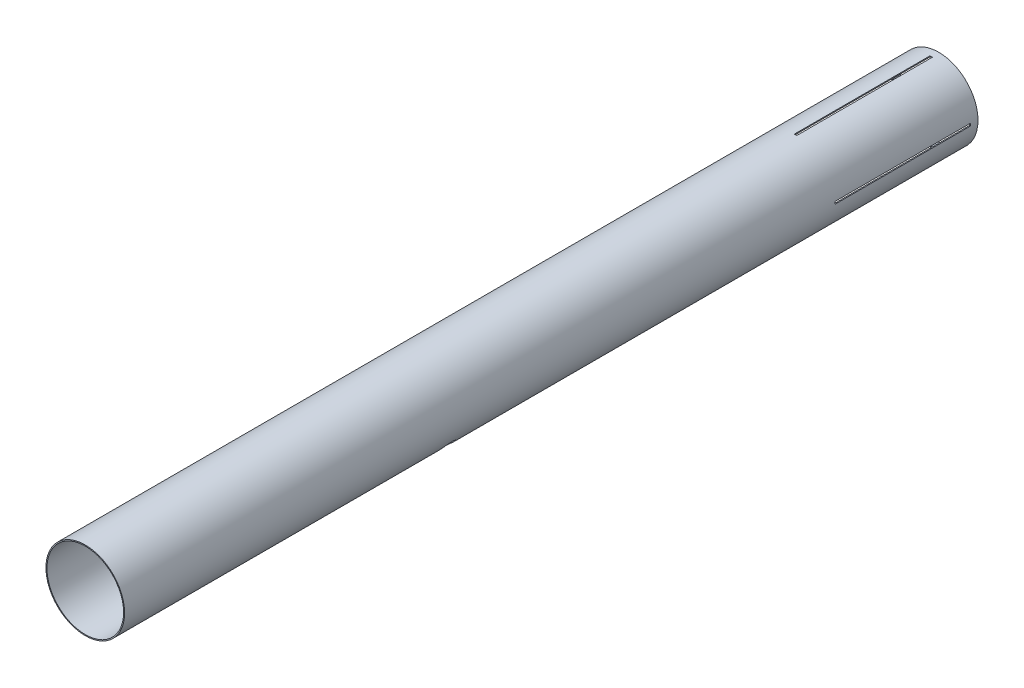
ISO-10303-21;
HEADER;
FILE_DESCRIPTION(('STEP AP214'),'2;1');
FILE_NAME('part.step','',(''),(''),'','','');
FILE_SCHEMA(('AUTOMOTIVE_DESIGN { 1 0 10303 214 1 1 1 1 }'));
ENDSEC;
DATA;
#1=APPLICATION_CONTEXT('core data for automotive mechanical design processes');
#2=APPLICATION_PROTOCOL_DEFINITION('international standard','automotive_design',2000,#1);
#3=PRODUCT_CONTEXT('',#1,'mechanical');
#4=PRODUCT('Part','Part','',(#3));
#5=PRODUCT_RELATED_PRODUCT_CATEGORY('part','',(#4));
#6=PRODUCT_DEFINITION_FORMATION('','',#4);
#7=PRODUCT_DEFINITION_CONTEXT('part definition',#1,'design');
#8=PRODUCT_DEFINITION('design','',#6,#7);
#9=PRODUCT_DEFINITION_SHAPE('','',#8);
#10=(LENGTH_UNIT() NAMED_UNIT(*) SI_UNIT(.MILLI.,.METRE.));
#11=(NAMED_UNIT(*) PLANE_ANGLE_UNIT() SI_UNIT($,.RADIAN.));
#12=(NAMED_UNIT(*) SI_UNIT($,.STERADIAN.) SOLID_ANGLE_UNIT());
#13=UNCERTAINTY_MEASURE_WITH_UNIT(LENGTH_MEASURE(1.E-05),#10,'distance_accuracy_value','');
#14=(GEOMETRIC_REPRESENTATION_CONTEXT(3) GLOBAL_UNCERTAINTY_ASSIGNED_CONTEXT((#13)) GLOBAL_UNIT_ASSIGNED_CONTEXT((#10,
#11,#12)) REPRESENTATION_CONTEXT('',''));
#15=CARTESIAN_POINT('',(0.,0.,0.));
#16=DIRECTION('',(0.,0.,1.));
#17=DIRECTION('',(1.,0.,0.));
#18=AXIS2_PLACEMENT_3D('',#15,#16,#17);
#19=CARTESIAN_POINT('',(0.,0.,1700.));
#20=DIRECTION('',(0.,0.,-1.));
#21=DIRECTION('',(-1.,0.,0.));
#22=AXIS2_PLACEMENT_3D('',#19,#20,#21);
#23=CYLINDRICAL_SURFACE('',#22,78.35);
#24=DIRECTION('',(0.,0.,-1.));
#25=VECTOR('',#24,1.);
#26=CARTESIAN_POINT('',(78.3132332367908,2.40000000000029,1700.));
#27=LINE('',#26,#25);
#28=CARTESIAN_POINT('',(78.3132332367908,2.4000000000003,285.));
#29=VERTEX_POINT('',#28);
#30=CARTESIAN_POINT('',(78.3132332367908,2.40000000000029,14.9999999999999));
#31=VERTEX_POINT('',#30);
#32=EDGE_CURVE('E261',#29,#31,#27,.T.);
#33=ORIENTED_EDGE('',*,*,#32,.T.);
#34=CARTESIAN_POINT('',(0.,0.,14.9999999999999));
#35=DIRECTION('',(0.,0.,-1.));
#36=DIRECTION('',(-1.,0.,0.));
#37=AXIS2_PLACEMENT_3D('',#34,#35,#36);
#38=CIRCLE('',#37,78.35);
#39=CARTESIAN_POINT('',(78.3132332367909,-2.3999999999997,14.9999999999999));
#40=VERTEX_POINT('',#39);
#41=EDGE_CURVE('E161',#31,#40,#38,.T.);
#42=ORIENTED_EDGE('',*,*,#41,.T.);
#43=DIRECTION('',(0.,0.,-1.));
#44=VECTOR('',#43,1.);
#45=CARTESIAN_POINT('',(78.3132332367909,-2.3999999999997,1700.));
#46=LINE('',#45,#44);
#47=CARTESIAN_POINT('',(78.3132332367909,-2.3999999999997,285.));
#48=VERTEX_POINT('',#47);
#49=EDGE_CURVE('E310',#40,#48,#46,.F.);
#50=ORIENTED_EDGE('',*,*,#49,.T.);
#51=CARTESIAN_POINT('',(0.,0.,285.));
#52=DIRECTION('',(0.,0.,1.));
#53=DIRECTION('',(1.,0.,0.));
#54=AXIS2_PLACEMENT_3D('',#51,#52,#53);
#55=CIRCLE('',#54,78.35);
#56=EDGE_CURVE('E306',#48,#29,#55,.T.);
#57=ORIENTED_EDGE('',*,*,#56,.T.);
#58=EDGE_LOOP('',(#33,#42,#50,#57));
#59=FACE_BOUND('',#58,.T.);
#60=CARTESIAN_POINT('',(-78.3132332367908,-2.40000000000025,14.9999999999999));
#61=VERTEX_POINT('',#60);
#62=CARTESIAN_POINT('',(-78.3132332367909,2.39999999999975,14.9999999999999));
#63=VERTEX_POINT('',#62);
#64=EDGE_CURVE('E265',#61,#63,#38,.T.);
#65=ORIENTED_EDGE('',*,*,#64,.T.);
#66=DIRECTION('',(0.,0.,-1.));
#67=VECTOR('',#66,1.);
#68=CARTESIAN_POINT('',(-78.3132332367909,2.39999999999975,1700.));
#69=LINE('',#68,#67);
#70=CARTESIAN_POINT('',(-78.3132332367909,2.39999999999975,285.));
#71=VERTEX_POINT('',#70);
#72=EDGE_CURVE('E315',#63,#71,#69,.F.);
#73=ORIENTED_EDGE('',*,*,#72,.T.);
#74=CARTESIAN_POINT('',(-78.3132332367908,-2.40000000000025,285.));
#75=VERTEX_POINT('',#74);
#76=EDGE_CURVE('E296',#71,#75,#55,.T.);
#77=ORIENTED_EDGE('',*,*,#76,.T.);
#78=DIRECTION('',(0.,0.,-1.));
#79=VECTOR('',#78,1.);
#80=CARTESIAN_POINT('',(-78.3132332367908,-2.40000000000025,1700.));
#81=LINE('',#80,#79);
#82=EDGE_CURVE('E308',#75,#61,#81,.T.);
#83=ORIENTED_EDGE('',*,*,#82,.T.);
#84=EDGE_LOOP('',(#65,#73,#77,#83));
#85=FACE_BOUND('',#84,.T.);
#86=DIRECTION('',(0.,0.,-1.));
#87=VECTOR('',#86,1.);
#88=CARTESIAN_POINT('',(2.40000000000002,-78.3132332367909,1700.));
#89=LINE('',#88,#87);
#90=CARTESIAN_POINT('',(2.40000000000002,-78.3132332367909,285.));
#91=VERTEX_POINT('',#90);
#92=CARTESIAN_POINT('',(2.40000000000002,-78.3132332367909,14.9999999999999));
#93=VERTEX_POINT('',#92);
#94=EDGE_CURVE('E269',#91,#93,#89,.T.);
#95=ORIENTED_EDGE('',*,*,#94,.T.);
#96=CARTESIAN_POINT('',(0.,0.,14.9999999999999));
#97=DIRECTION('',(0.,0.,-1.));
#98=DIRECTION('',(-1.,0.,0.));
#99=AXIS2_PLACEMENT_3D('',#96,#97,#98);
#100=CIRCLE('',#99,78.35);
#101=CARTESIAN_POINT('',(-2.39999999999997,-78.3132332367909,14.9999999999999));
#102=VERTEX_POINT('',#101);
#103=EDGE_CURVE('E288',#93,#102,#100,.T.);
#104=ORIENTED_EDGE('',*,*,#103,.T.);
#105=DIRECTION('',(0.,0.,-1.));
#106=VECTOR('',#105,1.);
#107=CARTESIAN_POINT('',(-2.39999999999998,-78.3132332367909,1700.));
#108=LINE('',#107,#106);
#109=CARTESIAN_POINT('',(-2.39999999999997,-78.3132332367909,285.));
#110=VERTEX_POINT('',#109);
#111=EDGE_CURVE('E283',#102,#110,#108,.F.);
#112=ORIENTED_EDGE('',*,*,#111,.T.);
#113=CARTESIAN_POINT('',(0.,0.,285.));
#114=DIRECTION('',(0.,0.,1.));
#115=DIRECTION('',(1.,0.,0.));
#116=AXIS2_PLACEMENT_3D('',#113,#114,#115);
#117=CIRCLE('',#116,78.35);
#118=EDGE_CURVE('E282',#110,#91,#117,.T.);
#119=ORIENTED_EDGE('',*,*,#118,.T.);
#120=EDGE_LOOP('',(#95,#104,#112,#119));
#121=FACE_BOUND('',#120,.T.);
#122=DIRECTION('',(0.,0.,-1.));
#123=VECTOR('',#122,1.);
#124=CARTESIAN_POINT('',(-2.39999999999998,78.3132332367909,1700.));
#125=LINE('',#124,#123);
#126=CARTESIAN_POINT('',(-2.39999999999997,78.3132332367909,285.));
#127=VERTEX_POINT('',#126);
#128=CARTESIAN_POINT('',(-2.39999999999997,78.3132332367909,14.9999999999999));
#129=VERTEX_POINT('',#128);
#130=EDGE_CURVE('E273',#127,#129,#125,.T.);
#131=ORIENTED_EDGE('',*,*,#130,.T.);
#132=CARTESIAN_POINT('',(2.40000000000003,78.3132332367909,14.9999999999999));
#133=VERTEX_POINT('',#132);
#134=EDGE_CURVE('E275',#129,#133,#100,.T.);
#135=ORIENTED_EDGE('',*,*,#134,.T.);
#136=DIRECTION('',(0.,0.,-1.));
#137=VECTOR('',#136,1.);
#138=CARTESIAN_POINT('',(2.40000000000002,78.3132332367909,1700.));
#139=LINE('',#138,#137);
#140=CARTESIAN_POINT('',(2.40000000000002,78.3132332367909,285.));
#141=VERTEX_POINT('',#140);
#142=EDGE_CURVE('E290',#133,#141,#139,.F.);
#143=ORIENTED_EDGE('',*,*,#142,.T.);
#144=EDGE_CURVE('E208',#141,#127,#117,.T.);
#145=ORIENTED_EDGE('',*,*,#144,.T.);
#146=EDGE_LOOP('',(#131,#135,#143,#145));
#147=FACE_BOUND('',#146,.T.);
#148=CARTESIAN_POINT('',(0.,0.,1700.));
#149=DIRECTION('',(0.,0.,1.));
#150=DIRECTION('',(1.,0.,0.));
#151=AXIS2_PLACEMENT_3D('',#148,#149,#150);
#152=CIRCLE('',#151,78.35);
#153=CARTESIAN_POINT('',(78.35,0.,1700.));
#154=VERTEX_POINT('',#153);
#155=EDGE_CURVE('E198',#154,#154,#152,.T.);
#156=ORIENTED_EDGE('',*,*,#155,.F.);
#157=EDGE_LOOP('',(#156));
#158=FACE_BOUND('',#157,.T.);
#159=CARTESIAN_POINT('',(0.,0.,0.));
#160=DIRECTION('',(0.,0.,1.));
#161=DIRECTION('',(1.,0.,0.));
#162=AXIS2_PLACEMENT_3D('',#159,#160,#161);
#163=CIRCLE('',#162,78.35);
#164=CARTESIAN_POINT('',(78.35,0.,0.));
#165=VERTEX_POINT('',#164);
#166=EDGE_CURVE('E209',#165,#165,#163,.T.);
#167=ORIENTED_EDGE('',*,*,#166,.T.);
#168=EDGE_LOOP('',(#167));
#169=FACE_BOUND('',#168,.T.);
#170=CARTESIAN_POINT('',(43.7704269799895,-64.9836304155856,1034.89));
#171=CARTESIAN_POINT('',(43.7704185873972,-64.9836330495455,1034.47274378583));
#172=CARTESIAN_POINT('',(43.7851471420884,-64.9737219518035,1034.05558703219));
#173=CARTESIAN_POINT('',(43.8438763845193,-64.9341078192532,1033.22415873229));
#174=CARTESIAN_POINT('',(43.8878822551469,-64.9044012801074,1032.80988771003));
#175=CARTESIAN_POINT('',(44.0047211961866,-64.8252416643284,1031.9870345879));
#176=CARTESIAN_POINT('',(44.0775760797465,-64.7757736455095,1031.5784570355));
#177=CARTESIAN_POINT('',(44.2512835874142,-64.6572304527577,1030.77021365579));
#178=CARTESIAN_POINT('',(44.3521350241034,-64.5881561103856,1030.3705474513));
#179=CARTESIAN_POINT('',(44.5806165403686,-64.4306630565429,1029.58328380249));
#180=CARTESIAN_POINT('',(44.7082210702476,-64.3422627982597,1029.1956752456));
#181=CARTESIAN_POINT('',(44.9889025976642,-64.1463203743606,1028.43478423851));
#182=CARTESIAN_POINT('',(45.1419798411203,-64.0387780239428,1028.06150192667));
#183=CARTESIAN_POINT('',(45.4720052838104,-63.8048596741469,1027.33182074178));
#184=CARTESIAN_POINT('',(45.6489512381604,-63.6784854458149,1026.97542028522));
#185=CARTESIAN_POINT('',(46.0249546498748,-63.4072532475293,1026.28183633831));
#186=CARTESIAN_POINT('',(46.22401226693,-63.2623951440836,1025.94465298677));
#187=CARTESIAN_POINT('',(46.6447482231952,-62.9528310910909,1025.2879311708));
#188=CARTESIAN_POINT('',(46.866662744575,-62.7879138793412,1024.96864356115));
#189=CARTESIAN_POINT('',(47.3290238003795,-62.4401286523775,1024.35417088082));
#190=CARTESIAN_POINT('',(47.5694704799832,-62.2572604965347,1024.05898599899));
#191=CARTESIAN_POINT('',(48.0666736530319,-61.8741937594589,1023.49470862881));
#192=CARTESIAN_POINT('',(48.3234312126406,-61.6739940450346,1023.22561784902));
#193=CARTESIAN_POINT('',(48.8509126361228,-61.2570309143429,1022.71540798926));
#194=CARTESIAN_POINT('',(49.1216365312667,-61.0402674609894,1022.47428897192));
#195=CARTESIAN_POINT('',(49.6768578962189,-60.5892828403475,1022.01991550933));
#196=CARTESIAN_POINT('',(49.9614480331917,-60.3549361732006,1021.80689875727));
#197=CARTESIAN_POINT('',(50.5398647024458,-59.8714175867554,1021.41257831312));
#198=CARTESIAN_POINT('',(50.8336912991311,-59.6222455640719,1021.23127484222));
#199=CARTESIAN_POINT('',(51.4280088291381,-59.1103728987661,1020.9017646628));
#200=CARTESIAN_POINT('',(51.7284993191694,-58.8476731544965,1020.75355576001));
#201=CARTESIAN_POINT('',(52.3335995984996,-58.3102099300419,1020.49137426413));
#202=CARTESIAN_POINT('',(52.6382093327444,-58.0354466109777,1020.37740121395));
#203=CARTESIAN_POINT('',(53.2453086751881,-57.4789275572815,1020.18576577491));
#204=CARTESIAN_POINT('',(53.547779331399,-57.197296678722,1020.10768066527));
#205=CARTESIAN_POINT('',(54.1518585249759,-56.6257150790329,1019.98642797146));
#206=CARTESIAN_POINT('',(54.4534670685889,-56.3357644183577,1019.94326013364));
#207=CARTESIAN_POINT('',(55.0534780831228,-55.7495555996889,1019.89219125522));
#208=CARTESIAN_POINT('',(55.3518808015405,-55.4532979339519,1019.88428747235));
#209=CARTESIAN_POINT('',(55.9432971276282,-54.8565990368764,1019.90380344009));
#210=CARTESIAN_POINT('',(56.2363107736518,-54.5561578353385,1019.93122293921));
#211=CARTESIAN_POINT('',(56.8111014170381,-53.9573096530345,1020.02057391802));
#212=CARTESIAN_POINT('',(57.092975243934,-53.658927441316,1020.08204943961));
#213=CARTESIAN_POINT('',(57.6476434795243,-53.0625812387903,1020.23870859702));
#214=CARTESIAN_POINT('',(57.9204379804708,-52.7646172437633,1020.33389189025));
#215=CARTESIAN_POINT('',(58.4553102185501,-52.1714358133198,1020.55724022727));
#216=CARTESIAN_POINT('',(58.7173876906627,-51.8762184459636,1020.68540608612));
#217=CARTESIAN_POINT('',(59.2293587223791,-51.2909033059705,1020.97375915673));
#218=CARTESIAN_POINT('',(59.4792521727392,-51.0008055792519,1021.13394665554));
#219=CARTESIAN_POINT('',(59.9669944206552,-50.4264303080915,1021.48620002339));
#220=CARTESIAN_POINT('',(60.2047644088533,-50.1421966141301,1021.67844649017));
#221=CARTESIAN_POINT('',(60.665559351662,-49.5837018978869,1022.0927734451));
#222=CARTESIAN_POINT('',(60.8885842723434,-49.3094408985534,1022.3148540019));
#223=CARTESIAN_POINT('',(61.3189526135696,-48.7732177545313,1022.78731940969));
#224=CARTESIAN_POINT('',(61.5262946367327,-48.511256706583,1023.03770677794));
#225=CARTESIAN_POINT('',(61.9244690796638,-48.001949321607,1023.56506316975));
#226=CARTESIAN_POINT('',(62.11530131504,-47.7546031478173,1023.84203249012));
#227=CARTESIAN_POINT('',(62.4826942513799,-47.2729166797975,1024.42533107783));
#228=CARTESIAN_POINT('',(62.6589777936026,-47.0388477603643,1024.73205916109));
#229=CARTESIAN_POINT('',(62.9932060883876,-46.5903073447042,1025.36894660709));
#230=CARTESIAN_POINT('',(63.1511506356771,-46.3758360678444,1025.69910623204));
#231=CARTESIAN_POINT('',(63.4482057053388,-45.9685897220003,1026.38061505639));
#232=CARTESIAN_POINT('',(63.5873158241913,-45.775815117873,1026.73196470955));
#233=CARTESIAN_POINT('',(63.8462817978859,-45.4139222273828,1027.45344340361));
#234=CARTESIAN_POINT('',(63.966137724388,-45.2448038529769,1027.82357237462));
#235=CARTESIAN_POINT('',(64.1864541208828,-44.9317075208343,1028.58075356351));
#236=CARTESIAN_POINT('',(64.286878326303,-44.7877766163121,1028.96783580128));
#237=CARTESIAN_POINT('',(64.4677699594065,-44.527006845484,1029.75555842047));
#238=CARTESIAN_POINT('',(64.5482373263192,-44.4101680616766,1030.15619884318));
#239=CARTESIAN_POINT('',(64.6889807584611,-44.2049066248782,1030.96812481877));
#240=CARTESIAN_POINT('',(64.7492587836656,-44.1164812135594,1031.37940933416));
#241=CARTESIAN_POINT('',(64.8494628526782,-43.969053071203,1032.20965875243));
#242=CARTESIAN_POINT('',(64.889389194602,-43.9100499091826,1032.62862354273));
#243=CARTESIAN_POINT('',(64.9483106087706,-43.8228499087805,1033.46451418495));
#244=CARTESIAN_POINT('',(64.967624677493,-43.7941836355311,1033.88136865493));
#245=CARTESIAN_POINT('',(64.9863732776753,-43.7663577942352,1034.71650533041));
#246=CARTESIAN_POINT('',(64.9858080161588,-43.7671979189085,1035.13478752099));
#247=CARTESIAN_POINT('',(64.9648003499233,-43.798373998858,1035.9697284803));
#248=CARTESIAN_POINT('',(64.944358911118,-43.8287085208083,1036.38638732694));
#249=CARTESIAN_POINT('',(64.8836569747425,-43.9185210146455,1037.21509276142));
#250=CARTESIAN_POINT('',(64.8433965141776,-43.9779989321169,1037.62713935787));
#251=CARTESIAN_POINT('',(64.7436038359295,-44.1247782156929,1038.44011964087));
#252=CARTESIAN_POINT('',(64.6842421075907,-44.2118333370536,1038.84111877799));
#253=CARTESIAN_POINT('',(64.5463126688734,-44.4129584097913,1039.6329024085));
#254=CARTESIAN_POINT('',(64.4677451038635,-44.5270281566947,1040.02368697919));
#255=CARTESIAN_POINT('',(64.2916098179148,-44.7809699180879,1040.79240025617));
#256=CARTESIAN_POINT('',(64.1940409875418,-44.9208434391675,1041.17032821029));
#257=CARTESIAN_POINT('',(63.9801690916805,-45.2249377742064,1041.91077321018));
#258=CARTESIAN_POINT('',(63.8638657949113,-45.3891588887397,1042.27329006562));
#259=CARTESIAN_POINT('',(63.6113369759639,-45.7424091035981,1042.98476310828));
#260=CARTESIAN_POINT('',(63.4748890542312,-45.9317123499956,1043.33350426041));
#261=CARTESIAN_POINT('',(63.183531309086,-46.3316853279084,1044.01041350401));
#262=CARTESIAN_POINT('',(63.0286213599965,-46.5423552048715,1044.33858145541));
#263=CARTESIAN_POINT('',(62.7008011967971,-46.9830547317894,1044.97218364948));
#264=CARTESIAN_POINT('',(62.5278895002713,-47.2130859758234,1045.27761601636));
#265=CARTESIAN_POINT('',(62.164643889968,-47.6903497719131,1045.86367680086));
#266=CARTESIAN_POINT('',(61.9743098424962,-47.9375824559646,1046.14430502811));
#267=CARTESIAN_POINT('',(61.5741140011588,-48.450575454638,1046.68260390098));
#268=CARTESIAN_POINT('',(61.3640161995441,-48.7165466369921,1046.93989830056));
#269=CARTESIAN_POINT('',(60.9274463683985,-49.2614518269188,1047.42521369087));
#270=CARTESIAN_POINT('',(60.7009741656431,-49.5403859716152,1047.65323437183));
#271=CARTESIAN_POINT('',(60.2326658587224,-50.1087219554688,1048.07834258799));
#272=CARTESIAN_POINT('',(59.9908301565177,-50.3981235206779,1048.27543093201));
#273=CARTESIAN_POINT('',(59.4929730978826,-50.9848669652262,1048.63721155927));
#274=CARTESIAN_POINT('',(59.2369518744444,-51.2822087701104,1048.80190414616));
#275=CARTESIAN_POINT('',(58.7135189147,-51.8806549233496,1049.09683237367));
#276=CARTESIAN_POINT('',(58.4461762930448,-52.1817302143447,1049.22724960319));
#277=CARTESIAN_POINT('',(57.9003697360255,-52.7866994543221,1049.45377518911));
#278=CARTESIAN_POINT('',(57.6219058232164,-53.0905933975869,1049.54988361509));
#279=CARTESIAN_POINT('',(57.0556335485241,-53.6986942847747,1049.70701823441));
#280=CARTESIAN_POINT('',(56.7678260491142,-54.0029011973127,1049.76804765611));
#281=CARTESIAN_POINT('',(56.1847831404379,-54.6092439673635,1049.85454247988));
#282=CARTESIAN_POINT('',(55.8895478213747,-54.9113798499702,1049.88000831364));
#283=CARTESIAN_POINT('',(55.2985208269948,-55.5064784673629,1049.89504850272));
#284=CARTESIAN_POINT('',(55.0028133338795,-55.7995106403069,1049.88518955052));
#285=CARTESIAN_POINT('',(54.4083996751838,-56.3792594897202,1049.8309143007));
#286=CARTESIAN_POINT('',(54.109693543779,-56.6659762380481,1049.78649839648));
#287=CARTESIAN_POINT('',(53.5115427939242,-57.2311681035575,1049.66346097936));
#288=CARTESIAN_POINT('',(53.2120981868208,-57.5096433465259,1049.58483998881));
#289=CARTESIAN_POINT('',(52.6147982971133,-58.0566059677919,1049.39400422158));
#290=CARTESIAN_POINT('',(52.3169430203181,-58.3250933096052,1049.28178932221));
#291=CARTESIAN_POINT('',(51.7257759733394,-58.8500005667144,1049.02487128859));
#292=CARTESIAN_POINT('',(51.4324565260322,-59.1064428294011,1048.88023144578));
#293=CARTESIAN_POINT('',(50.8521555713532,-59.6064382243742,1048.55941406077));
#294=CARTESIAN_POINT('',(50.5651740448707,-59.8499913955278,1048.38323661367));
#295=CARTESIAN_POINT('',(49.9999059203313,-60.3230284209333,1048.0006042255));
#296=CARTESIAN_POINT('',(49.7216197760019,-60.5525115416054,1047.79414770765));
#297=CARTESIAN_POINT('',(49.1760978473031,-60.9963734755033,1047.35241114154));
#298=CARTESIAN_POINT('',(48.908862195132,-61.210752108054,1047.11713074859));
#299=CARTESIAN_POINT('',(48.3838536068781,-61.6266097850768,1046.61564708244));
#300=CARTESIAN_POINT('',(48.1262807392164,-61.8278493137862,1046.34903564299));
#301=CARTESIAN_POINT('',(47.6272042768601,-62.2131120952494,1045.78961681325));
#302=CARTESIAN_POINT('',(47.3857008790353,-62.3971351370924,1045.49680910213));
#303=CARTESIAN_POINT('',(46.9209475252783,-62.7473656081468,1044.88691462706));
#304=CARTESIAN_POINT('',(46.6977018791185,-62.913568833824,1044.56982216466));
#305=CARTESIAN_POINT('',(46.2716602648854,-63.2275731561657,1043.91356017449));
#306=CARTESIAN_POINT('',(46.068864135551,-63.3753743979471,1043.57439082084));
#307=CARTESIAN_POINT('',(45.6838482919443,-63.6534796786702,1042.87285045492));
#308=CARTESIAN_POINT('',(45.501848439678,-63.7835990997252,1042.51028549335));
#309=CARTESIAN_POINT('',(45.1626286266663,-64.0242355518477,1041.76748997904));
#310=CARTESIAN_POINT('',(45.0054086126821,-64.1347526250306,1041.38725946427));
#311=CARTESIAN_POINT('',(44.7175567944082,-64.335786715727,1040.61210047453));
#312=CARTESIAN_POINT('',(44.5869033089367,-64.4263200473564,1040.21718429858));
#313=CARTESIAN_POINT('',(44.3535033462876,-64.5872221257257,1039.4153232428));
#314=CARTESIAN_POINT('',(44.250751304257,-64.6575948935794,1039.00838077955));
#315=CARTESIAN_POINT('',(44.0329706670176,-64.8062118515977,1037.99239799378));
#316=CARTESIAN_POINT('',(43.9347109637274,-64.872720213305,1037.37792555308));
#317=CARTESIAN_POINT('',(43.8034463565135,-64.961426874592,1036.13889431718));
#318=CARTESIAN_POINT('',(43.7704395377317,-64.9836264744207,1035.51433581849));
#319=CARTESIAN_POINT('',(43.7704269799895,-64.9836304155856,1034.89));
#320=B_SPLINE_CURVE_WITH_KNOTS('',3,(#170,#171,#172,#173,#174,#175,#176,#177,#178,#179,#180,
#181,#182,#183,#184,#185,#186,#187,#188,#189,#190,#191,#192,#193,#194,#195,#196,#197,#198,#199,
#200,#201,#202,#203,#204,#205,#206,#207,#208,#209,#210,#211,#212,#213,#214,#215,#216,#217,#218,
#219,#220,#221,#222,#223,#224,#225,#226,#227,#228,#229,#230,#231,#232,#233,#234,#235,#236,#237,
#238,#239,#240,#241,#242,#243,#244,#245,#246,#247,#248,#249,#250,#251,#252,#253,#254,#255,#256,
#257,#258,#259,#260,#261,#262,#263,#264,#265,#266,#267,#268,#269,#270,#271,#272,#273,#274,#275,
#276,#277,#278,#279,#280,#281,#282,#283,#284,#285,#286,#287,#288,#289,#290,#291,#292,#293,#294,
#295,#296,#297,#298,#299,#300,#301,#302,#303,#304,#305,#306,#307,#308,#309,#310,#311,#312,#313,
#314,#315,#316,#317,#318,#319),.UNSPECIFIED.,.T.,.F.,(4,2,2,2,2,2,2,2,2,2,2,2,2,2,2,2,2,2,2,2,2,
2,2,2,2,2,2,2,2,2,2,2,2,2,2,2,2,2,2,2,2,2,2,2,2,2,2,2,2,2,2,2,2,2,2,2,2,2,2,2,2,2,2,2,2,2,2,2,2,
2,2,2,2,2,4),(0.,1.2512201815193,2.50266192228976,3.75505170827783,5.00738838473607,
6.2585344605956,7.50969261595667,8.76073318017256,10.0117827800136,11.2773839703529,
12.5429950762847,13.8086889944019,15.0743857464918,16.3501819344891,17.6259870203369,
18.9017074911477,20.1774109286545,21.437676508019,22.697932932161,23.9580913523073,
25.2182408005425,26.4619128488018,27.7055722566655,28.9492624002595,30.1929636929127,
31.4439236975604,32.6948865806339,33.9459607963561,35.1970489830685,36.4681521948665,
37.7392696330668,39.010414300114,40.2815542361176,41.5550440363452,42.8285377144412,
44.1019077262975,45.3752590850323,46.6286047856772,47.8819374339598,49.1352091776408,
50.3884785812648,51.6308584880832,52.8732289916388,54.1156720557235,55.358130459203,
56.6155042039001,57.8728865084241,59.1303724384454,60.3878680188794,61.6629618753456,
62.9380692229775,64.2131432232563,65.4882052714666,66.7563693490938,68.0245308548904,
69.2925756321627,70.5606050177479,71.8083839600148,73.0561486973931,74.3038943808019,
75.5516446215911,76.7969802170441,78.0423120569616,79.2877087704914,80.533120378542,
81.7970703887682,83.0610358810032,84.3252988783538,85.5895519051794,86.8661295257228,
88.1427044035287,89.4182332382843,90.6935074857546,92.5657492272818,94.437936026714),.UNSPECIFIED.);
#321=CARTESIAN_POINT('',(43.7704269799895,-64.9836304155856,1034.89));
#322=VERTEX_POINT('',#321);
#323=EDGE_CURVE('E207',#322,#322,#320,.T.);
#324=ORIENTED_EDGE('',*,*,#323,.F.);
#325=EDGE_LOOP('',(#324));
#326=FACE_BOUND('',#325,.T.);
#327=ADVANCED_FACE('F34',(#59,#85,#121,#147,#158,#169,#326),#23,.T.);
#328=CARTESIAN_POINT('',(0.,0.,1700.));
#329=DIRECTION('',(0.,0.,-1.));
#330=DIRECTION('',(-1.,0.,0.));
#331=AXIS2_PLACEMENT_3D('',#328,#329,#330);
#332=CYLINDRICAL_SURFACE('',#331,76.35);
#333=CARTESIAN_POINT('',(0.,0.,285.));
#334=DIRECTION('',(0.,0.,1.));
#335=DIRECTION('',(1.,0.,0.));
#336=AXIS2_PLACEMENT_3D('',#333,#334,#335);
#337=CIRCLE('',#336,76.35);
#338=CARTESIAN_POINT('',(76.312269655672,-2.39999999999971,285.));
#339=VERTEX_POINT('',#338);
#340=CARTESIAN_POINT('',(76.312269655672,2.40000000000029,285.));
#341=VERTEX_POINT('',#340);
#342=EDGE_CURVE('E11',#339,#341,#337,.T.);
#343=ORIENTED_EDGE('',*,*,#342,.F.);
#344=DIRECTION('',(0.,0.,-1.));
#345=VECTOR('',#344,1.);
#346=CARTESIAN_POINT('',(76.312269655672,-2.39999999999971,1700.));
#347=LINE('',#346,#345);
#348=CARTESIAN_POINT('',(76.312269655672,-2.39999999999971,14.9999999999999));
#349=VERTEX_POINT('',#348);
#350=EDGE_CURVE('E38',#349,#339,#347,.F.);
#351=ORIENTED_EDGE('',*,*,#350,.F.);
#352=CARTESIAN_POINT('',(0.,0.,14.9999999999999));
#353=DIRECTION('',(0.,0.,-1.));
#354=DIRECTION('',(-1.,0.,0.));
#355=AXIS2_PLACEMENT_3D('',#352,#353,#354);
#356=CIRCLE('',#355,76.35);
#357=CARTESIAN_POINT('',(76.312269655672,2.40000000000029,14.9999999999999));
#358=VERTEX_POINT('',#357);
#359=EDGE_CURVE('E156',#358,#349,#356,.T.);
#360=ORIENTED_EDGE('',*,*,#359,.F.);
#361=DIRECTION('',(0.,0.,-1.));
#362=VECTOR('',#361,1.);
#363=CARTESIAN_POINT('',(76.312269655672,2.40000000000029,1700.));
#364=LINE('',#363,#362);
#365=EDGE_CURVE('E149',#341,#358,#364,.T.);
#366=ORIENTED_EDGE('',*,*,#365,.F.);
#367=EDGE_LOOP('',(#343,#351,#360,#366));
#368=FACE_BOUND('',#367,.T.);
#369=CARTESIAN_POINT('',(-76.312269655672,2.39999999999976,285.));
#370=VERTEX_POINT('',#369);
#371=CARTESIAN_POINT('',(-76.312269655672,-2.40000000000024,285.));
#372=VERTEX_POINT('',#371);
#373=EDGE_CURVE('E44',#370,#372,#337,.T.);
#374=ORIENTED_EDGE('',*,*,#373,.F.);
#375=DIRECTION('',(0.,0.,-1.));
#376=VECTOR('',#375,1.);
#377=CARTESIAN_POINT('',(-76.312269655672,2.39999999999975,1700.));
#378=LINE('',#377,#376);
#379=CARTESIAN_POINT('',(-76.312269655672,2.39999999999975,14.9999999999999));
#380=VERTEX_POINT('',#379);
#381=EDGE_CURVE('E175',#380,#370,#378,.F.);
#382=ORIENTED_EDGE('',*,*,#381,.F.);
#383=CARTESIAN_POINT('',(-76.312269655672,-2.40000000000024,14.9999999999999));
#384=VERTEX_POINT('',#383);
#385=EDGE_CURVE('E170',#384,#380,#356,.T.);
#386=ORIENTED_EDGE('',*,*,#385,.F.);
#387=DIRECTION('',(0.,0.,-1.));
#388=VECTOR('',#387,1.);
#389=CARTESIAN_POINT('',(-76.312269655672,-2.40000000000024,1700.));
#390=LINE('',#389,#388);
#391=EDGE_CURVE('E174',#372,#384,#390,.T.);
#392=ORIENTED_EDGE('',*,*,#391,.F.);
#393=EDGE_LOOP('',(#374,#382,#386,#392));
#394=FACE_BOUND('',#393,.T.);
#395=CARTESIAN_POINT('',(0.,0.,285.));
#396=DIRECTION('',(0.,0.,1.));
#397=DIRECTION('',(1.,0.,0.));
#398=AXIS2_PLACEMENT_3D('',#395,#396,#397);
#399=CIRCLE('',#398,76.35);
#400=CARTESIAN_POINT('',(-2.39999999999997,-76.312269655672,285.));
#401=VERTEX_POINT('',#400);
#402=CARTESIAN_POINT('',(2.40000000000002,-76.312269655672,285.));
#403=VERTEX_POINT('',#402);
#404=EDGE_CURVE('E181',#401,#403,#399,.T.);
#405=ORIENTED_EDGE('',*,*,#404,.F.);
#406=DIRECTION('',(0.,0.,-1.));
#407=VECTOR('',#406,1.);
#408=CARTESIAN_POINT('',(-2.39999999999998,-76.312269655672,1700.));
#409=LINE('',#408,#407);
#410=CARTESIAN_POINT('',(-2.39999999999997,-76.312269655672,14.9999999999999));
#411=VERTEX_POINT('',#410);
#412=EDGE_CURVE('E183',#411,#401,#409,.F.);
#413=ORIENTED_EDGE('',*,*,#412,.F.);
#414=CARTESIAN_POINT('',(0.,0.,14.9999999999999));
#415=DIRECTION('',(0.,0.,-1.));
#416=DIRECTION('',(-1.,0.,0.));
#417=AXIS2_PLACEMENT_3D('',#414,#415,#416);
#418=CIRCLE('',#417,76.35);
#419=CARTESIAN_POINT('',(2.40000000000003,-76.312269655672,14.9999999999999));
#420=VERTEX_POINT('',#419);
#421=EDGE_CURVE('E188',#420,#411,#418,.T.);
#422=ORIENTED_EDGE('',*,*,#421,.F.);
#423=DIRECTION('',(0.,0.,-1.));
#424=VECTOR('',#423,1.);
#425=CARTESIAN_POINT('',(2.40000000000002,-76.312269655672,1700.));
#426=LINE('',#425,#424);
#427=EDGE_CURVE('E189',#403,#420,#426,.T.);
#428=ORIENTED_EDGE('',*,*,#427,.F.);
#429=EDGE_LOOP('',(#405,#413,#422,#428));
#430=FACE_BOUND('',#429,.T.);
#431=CARTESIAN_POINT('',(2.40000000000002,76.312269655672,285.));
#432=VERTEX_POINT('',#431);
#433=CARTESIAN_POINT('',(-2.39999999999997,76.312269655672,285.));
#434=VERTEX_POINT('',#433);
#435=EDGE_CURVE('E185',#432,#434,#399,.T.);
#436=ORIENTED_EDGE('',*,*,#435,.F.);
#437=DIRECTION('',(0.,0.,-1.));
#438=VECTOR('',#437,1.);
#439=CARTESIAN_POINT('',(2.40000000000002,76.312269655672,1700.));
#440=LINE('',#439,#438);
#441=CARTESIAN_POINT('',(2.40000000000002,76.312269655672,14.9999999999999));
#442=VERTEX_POINT('',#441);
#443=EDGE_CURVE('E196',#442,#432,#440,.F.);
#444=ORIENTED_EDGE('',*,*,#443,.F.);
#445=CARTESIAN_POINT('',(-2.39999999999997,76.312269655672,14.9999999999999));
#446=VERTEX_POINT('',#445);
#447=EDGE_CURVE('E193',#446,#442,#418,.T.);
#448=ORIENTED_EDGE('',*,*,#447,.F.);
#449=DIRECTION('',(0.,0.,-1.));
#450=VECTOR('',#449,1.);
#451=CARTESIAN_POINT('',(-2.39999999999998,76.312269655672,1700.));
#452=LINE('',#451,#450);
#453=EDGE_CURVE('E191',#434,#446,#452,.T.);
#454=ORIENTED_EDGE('',*,*,#453,.F.);
#455=EDGE_LOOP('',(#436,#444,#448,#454));
#456=FACE_BOUND('',#455,.T.);
#457=CARTESIAN_POINT('',(0.,0.,0.));
#458=DIRECTION('',(0.,0.,1.));
#459=DIRECTION('',(1.,0.,0.));
#460=AXIS2_PLACEMENT_3D('',#457,#458,#459);
#461=CIRCLE('',#460,76.35);
#462=CARTESIAN_POINT('',(76.35,0.,0.));
#463=VERTEX_POINT('',#462);
#464=EDGE_CURVE('E230',#463,#463,#461,.T.);
#465=ORIENTED_EDGE('',*,*,#464,.F.);
#466=EDGE_LOOP('',(#465));
#467=FACE_BOUND('',#466,.T.);
#468=CARTESIAN_POINT('',(0.,0.,1700.));
#469=DIRECTION('',(0.,0.,1.));
#470=DIRECTION('',(1.,0.,0.));
#471=AXIS2_PLACEMENT_3D('',#468,#469,#470);
#472=CIRCLE('',#471,76.35);
#473=CARTESIAN_POINT('',(76.35,0.,1700.));
#474=VERTEX_POINT('',#473);
#475=EDGE_CURVE('E232',#474,#474,#472,.T.);
#476=ORIENTED_EDGE('',*,*,#475,.T.);
#477=EDGE_LOOP('',(#476));
#478=FACE_BOUND('',#477,.T.);
#479=CARTESIAN_POINT('',(42.3288424571591,-63.5420458927552,1034.89));
#480=CARTESIAN_POINT('',(42.3288336539238,-63.5420485564455,1034.47296654523));
#481=CARTESIAN_POINT('',(42.3436122176271,-63.5322135210619,1034.05603523828));
#482=CARTESIAN_POINT('',(42.4025378488622,-63.4929022984525,1033.22505952206));
#483=CARTESIAN_POINT('',(42.4466899800212,-63.4634227247581,1032.81101562298));
#484=CARTESIAN_POINT('',(42.5639098953501,-63.3848642513507,1031.98862603803));
#485=CARTESIAN_POINT('',(42.6369990324369,-63.3357708781672,1031.5802847911));
#486=CARTESIAN_POINT('',(42.8112521229423,-63.2181163576276,1030.77251242365));
#487=CARTESIAN_POINT('',(42.9124149220014,-63.1495560107301,1030.37308093751));
#488=CARTESIAN_POINT('',(43.1415786168602,-62.9932210162271,1029.58629182318));
#489=CARTESIAN_POINT('',(43.2695531859946,-62.9054652130789,1029.19892277623));
#490=CARTESIAN_POINT('',(43.5510203383731,-62.7109270806973,1028.43849829647));
#491=CARTESIAN_POINT('',(43.7045131596169,-62.604144574008,1028.0654429972));
#492=CARTESIAN_POINT('',(44.035400589294,-62.371843261396,1027.33619154237));
#493=CARTESIAN_POINT('',(44.212793142929,-62.246326066103,1026.97999394101));
#494=CARTESIAN_POINT('',(44.5897042355703,-61.976886174375,1026.28678470962));
#495=CARTESIAN_POINT('',(44.7892229469433,-61.8329633345556,1025.94977322909));
#496=CARTESIAN_POINT('',(45.2110158592172,-61.5252428146595,1025.29315491117));
#497=CARTESIAN_POINT('',(45.4335388277896,-61.3612233080317,1024.97381178623));
#498=CARTESIAN_POINT('',(45.8971250548548,-61.0152443430517,1024.35920716067));
#499=CARTESIAN_POINT('',(46.1381884651659,-60.8332847377937,1024.06394585729));
#500=CARTESIAN_POINT('',(46.6366180204691,-60.4520205628719,1023.49948985703));
#501=CARTESIAN_POINT('',(46.8939852587552,-60.2527148296841,1023.2302969113));
#502=CARTESIAN_POINT('',(47.4226638583144,-59.837500006198,1022.719855102));
#503=CARTESIAN_POINT('',(47.6939752529058,-59.6215908762265,1022.4786063052));
#504=CARTESIAN_POINT('',(48.2504626140253,-59.1721583319299,1022.02384440583));
#505=CARTESIAN_POINT('',(48.5357360947027,-58.9385018982928,1021.81058197381));
#506=CARTESIAN_POINT('',(49.1154761186338,-58.4562626922391,1021.41577289479));
#507=CARTESIAN_POINT('',(49.4099427294988,-58.2076798100325,1021.2342264811));
#508=CARTESIAN_POINT('',(50.0054789407089,-57.6968668406585,1020.90423993822));
#509=CARTESIAN_POINT('',(50.3065480784085,-57.4346377079404,1020.75579749749));
#510=CARTESIAN_POINT('',(50.9127286998064,-56.8979823464267,1020.49316477058));
#511=CARTESIAN_POINT('',(51.2178401265214,-56.6235562894402,1020.3789740021));
#512=CARTESIAN_POINT('',(51.8256535553264,-56.0677407912831,1020.18698872131));
#513=CARTESIAN_POINT('',(52.1283368068247,-55.7864844092283,1020.10874952477));
#514=CARTESIAN_POINT('',(52.7327396678545,-55.2155184581605,1019.98717205734));
#515=CARTESIAN_POINT('',(53.0344592847324,-54.9258089537642,1019.94383351973));
#516=CARTESIAN_POINT('',(53.6345824414009,-54.3399475174958,1019.8924102652));
#517=CARTESIAN_POINT('',(53.9329862499783,-54.0437961136601,1019.88432266966));
#518=CARTESIAN_POINT('',(54.5242914416014,-53.4471752082684,1019.90345957306));
#519=CARTESIAN_POINT('',(54.8171928659525,-53.1467057391572,1019.93068380683));
#520=CARTESIAN_POINT('',(55.3914472543817,-52.5478810445256,1020.01960458736));
#521=CARTESIAN_POINT('',(55.6729036902642,-52.2495536564666,1020.08082141578));
#522=CARTESIAN_POINT('',(56.2266430811034,-51.6531962222664,1020.23690406699));
#523=CARTESIAN_POINT('',(56.4989261342167,-51.3551661729767,1020.33176952961));
#524=CARTESIAN_POINT('',(57.0326923000193,-50.761735541596,1020.55442281016));
#525=CARTESIAN_POINT('',(57.2941751366319,-50.4663350268727,1020.68221146908));
#526=CARTESIAN_POINT('',(57.8048878295276,-49.8805418767601,1020.96975086051));
#527=CARTESIAN_POINT('',(58.0541175707567,-49.5901492884107,1021.12950189306));
#528=CARTESIAN_POINT('',(58.5405411244166,-49.0150005223417,1021.48086816075));
#529=CARTESIAN_POINT('',(58.7776522175553,-48.7302895482406,1021.67267187533));
#530=CARTESIAN_POINT('',(59.2370896375661,-48.170746075069,1022.08607326296));
#531=CARTESIAN_POINT('',(59.4594159290999,-47.8959135996107,1022.30767100721));
#532=CARTESIAN_POINT('',(59.8883701141994,-47.3584614533788,1022.7791361367));
#533=CARTESIAN_POINT('',(60.0949965384617,-47.0958429265619,1023.02900616241));
#534=CARTESIAN_POINT('',(60.4917451148011,-46.5851462732251,1023.55529935658));
#535=CARTESIAN_POINT('',(60.6818670729824,-46.3370683175402,1023.83172283691));
#536=CARTESIAN_POINT('',(61.0480101713659,-45.8536416937393,1024.41414499517));
#537=CARTESIAN_POINT('',(61.2237399323402,-45.6185777439241,1024.72056333525));
#538=CARTESIAN_POINT('',(61.5568839387472,-45.1680314108901,1025.35686040763));
#539=CARTESIAN_POINT('',(61.7142979685916,-44.9525492581688,1025.686739416));
#540=CARTESIAN_POINT('',(62.0103373382148,-44.5432865030354,1026.36772417932));
#541=CARTESIAN_POINT('',(62.1489622393791,-44.3495064072557,1026.71883042952));
#542=CARTESIAN_POINT('',(62.4070227801855,-43.9856315380047,1027.43986621225));
#543=CARTESIAN_POINT('',(62.5264584935591,-43.815536673527,1027.80979567244));
#544=CARTESIAN_POINT('',(62.7460361079008,-43.5005105146852,1028.56669543617));
#545=CARTESIAN_POINT('',(62.8461383955898,-43.3556309440419,1028.95369877256));
#546=CARTESIAN_POINT('',(63.0264769812163,-43.0930515109668,1029.74132236013));
#547=CARTESIAN_POINT('',(63.1067132143988,-42.9753517371299,1030.1419426557));
#548=CARTESIAN_POINT('',(63.2470965254677,-42.7684804854746,1030.95388421002));
#549=CARTESIAN_POINT('',(63.3072456660285,-42.6793060785239,1031.36520436536));
#550=CARTESIAN_POINT('',(63.4073032671892,-42.5305119511955,1032.19557893844));
#551=CARTESIAN_POINT('',(63.4472120413255,-42.470891773004,1032.61463323628));
#552=CARTESIAN_POINT('',(63.5061901118227,-42.3826507725987,1033.45040248188));
#553=CARTESIAN_POINT('',(63.5255929920243,-42.3535338038828,1033.86704158925));
#554=CARTESIAN_POINT('',(63.5446675899921,-42.3249101805471,1034.70178427859));
#555=CARTESIAN_POINT('',(63.5443395239666,-42.3254032014661,1035.11988784446));
#556=CARTESIAN_POINT('',(63.5239539477439,-42.3559925958852,1035.95450497532));
#557=CARTESIAN_POINT('',(63.5038974488346,-42.3860874519825,1036.37101862072));
#558=CARTESIAN_POINT('',(63.4441094100806,-42.4755266886632,1037.19946604246));
#559=CARTESIAN_POINT('',(63.4043779100088,-42.5348710101189,1037.61139982806));
#560=CARTESIAN_POINT('',(63.3058016697825,-42.6814442812974,1038.42396810038));
#561=CARTESIAN_POINT('',(63.247136606533,-42.7684109799994,1038.82467176286));
#562=CARTESIAN_POINT('',(63.1107461734953,-42.9694188231453,1039.61590836076));
#563=CARTESIAN_POINT('',(63.03302095654,-43.0834597504956,1040.00644137771));
#564=CARTESIAN_POINT('',(62.8587028078845,-43.337393564081,1040.77470369753));
#565=CARTESIAN_POINT('',(62.7621087256384,-43.4772880267304,1041.15243221799));
#566=CARTESIAN_POINT('',(62.5503026795481,-43.7814625248292,1041.89253848755));
#567=CARTESIAN_POINT('',(62.4350904744318,-43.9457428762929,1042.25491603765));
#568=CARTESIAN_POINT('',(62.1847802443462,-44.2992446803815,1042.96639104521));
#569=CARTESIAN_POINT('',(62.0494498927403,-44.4887543788096,1043.31526356799));
#570=CARTESIAN_POINT('',(61.7603826125016,-44.8891812374583,1043.99249265788));
#571=CARTESIAN_POINT('',(61.6066455527208,-45.1000985502064,1044.32084907878));
#572=CARTESIAN_POINT('',(61.281201455133,-45.5413216617855,1044.95489351931));
#573=CARTESIAN_POINT('',(61.1094928559613,-45.7716291448908,1045.26057956539));
#574=CARTESIAN_POINT('',(60.7486580009263,-46.2494612080314,1045.84721709159));
#575=CARTESIAN_POINT('',(60.5595316034453,-46.4969859280494,1046.12816837058));
#576=CARTESIAN_POINT('',(60.1615869573199,-47.0107760779635,1046.66740571356));
#577=CARTESIAN_POINT('',(59.9525187717516,-47.2772645908144,1046.92529496036));
#578=CARTESIAN_POINT('',(59.5179308117106,-47.8232174075751,1047.41182905593));
#579=CARTESIAN_POINT('',(59.292410853525,-48.1026818563712,1047.64047357806));
#580=CARTESIAN_POINT('',(58.8259045254723,-48.6720750393765,1048.06685284866));
#581=CARTESIAN_POINT('',(58.584918572103,-48.962003491699,1048.26458842902));
#582=CARTESIAN_POINT('',(58.0886356052735,-49.5497813648348,1048.62767941357));
#583=CARTESIAN_POINT('',(57.8333387323652,-49.8476307078394,1048.7930351357));
#584=CARTESIAN_POINT('',(57.3112583298601,-50.4469941359019,1049.08926313746));
#585=CARTESIAN_POINT('',(57.0445472569213,-50.7484782967052,1049.22032362371));
#586=CARTESIAN_POINT('',(56.499850360969,-51.3542139772541,1049.44814621136));
#587=CARTESIAN_POINT('',(56.2218645613072,-51.6584654912672,1049.54490838379));
#588=CARTESIAN_POINT('',(55.6563860370619,-52.2672148919484,1049.70335104036));
#589=CARTESIAN_POINT('',(55.3688942385607,-52.5717127518143,1049.76503493125));
#590=CARTESIAN_POINT('',(54.786313759359,-53.1785598290896,1049.85283148018));
#591=CARTESIAN_POINT('',(54.491225176244,-53.4809090740359,1049.87894459491));
#592=CARTESIAN_POINT('',(53.9005724521448,-54.0760909628466,1049.89524829004));
#593=CARTESIAN_POINT('',(53.6050997135295,-54.3689981426528,1049.88603542769));
#594=CARTESIAN_POINT('',(53.0109992790247,-54.9484178330735,1049.8330935389));
#595=CARTESIAN_POINT('',(52.7123716209832,-55.2349304202729,1049.78936492606));
#596=CARTESIAN_POINT('',(52.1142234831869,-55.7996360844626,1049.66773981051));
#597=CARTESIAN_POINT('',(51.8147030183191,-56.0778292993301,1049.58984387438));
#598=CARTESIAN_POINT('',(51.2171007438816,-56.6241556588227,1049.40049329962));
#599=CARTESIAN_POINT('',(50.9190189397292,-56.8922887655922,1049.28903853471));
#600=CARTESIAN_POINT('',(50.3273154633459,-57.4163713200763,1049.03369827616));
#601=CARTESIAN_POINT('',(50.0336856116654,-57.6723456124036,1048.88988269327));
#602=CARTESIAN_POINT('',(49.4526239861679,-58.1713603133154,1048.5707566181));
#603=CARTESIAN_POINT('',(49.1651921921893,-58.4144007639761,1048.3954462283));
#604=CARTESIAN_POINT('',(48.5988892093982,-58.8863852006235,1048.01458545419));
#605=CARTESIAN_POINT('',(48.320018500656,-59.1153283968158,1047.8090333778));
#606=CARTESIAN_POINT('',(47.7732018839514,-59.558101637529,1047.36913714859));
#607=CARTESIAN_POINT('',(47.50525611362,-59.7719314916787,1047.1347926332));
#608=CARTESIAN_POINT('',(46.9785081703595,-60.1868460706167,1046.63503626844));
#609=CARTESIAN_POINT('',(46.7199141234825,-60.3876796246687,1046.3691964207));
#610=CARTESIAN_POINT('',(46.2187106120806,-60.7721405809754,1045.81129605424));
#611=CARTESIAN_POINT('',(45.9761013494476,-60.9557677659217,1045.51923520444));
#612=CARTESIAN_POINT('',(45.5090688348321,-61.3052384314001,1044.91080011897));
#613=CARTESIAN_POINT('',(45.2846498789713,-61.4710777138214,1044.59442017386));
#614=CARTESIAN_POINT('',(44.8562140038624,-61.7844075939654,1043.93953738024));
#615=CARTESIAN_POINT('',(44.6521969349221,-61.9318983263166,1043.60103469406));
#616=CARTESIAN_POINT('',(44.2645833014453,-62.2095379428879,1042.90056278909));
#617=CARTESIAN_POINT('',(44.0812201977184,-62.3394913293878,1042.53838678349));
#618=CARTESIAN_POINT('',(43.7393032546778,-62.5798652995366,1041.79627873894));
#619=CARTESIAN_POINT('',(43.5807493568686,-62.6902859292405,1041.41634674185));
#620=CARTESIAN_POINT('',(43.2902868001351,-62.8912138107886,1040.6416826105));
#621=CARTESIAN_POINT('',(43.1583567883147,-62.9817370260027,1040.24696264019));
#622=CARTESIAN_POINT('',(42.9224910232519,-63.1427159562982,1039.44539542606));
#623=CARTESIAN_POINT('',(42.8185497842227,-63.2131756039855,1039.0385505761));
#624=CARTESIAN_POINT('',(42.5969448467736,-63.3628343351155,1038.01794025946));
#625=CARTESIAN_POINT('',(42.4966104813549,-63.4300163107631,1037.39852180026));
#626=CARTESIAN_POINT('',(42.3625670058309,-63.5196193570484,1036.14932441143));
#627=CARTESIAN_POINT('',(42.3288557463566,-63.5420418716987,1035.5195458167));
#628=CARTESIAN_POINT('',(42.3288424571591,-63.5420458927552,1034.89));
#629=B_SPLINE_CURVE_WITH_KNOTS('',3,(#479,#480,#481,#482,#483,#484,#485,#486,#487,#488,#489,
#490,#491,#492,#493,#494,#495,#496,#497,#498,#499,#500,#501,#502,#503,#504,#505,#506,#507,#508,
#509,#510,#511,#512,#513,#514,#515,#516,#517,#518,#519,#520,#521,#522,#523,#524,#525,#526,#527,
#528,#529,#530,#531,#532,#533,#534,#535,#536,#537,#538,#539,#540,#541,#542,#543,#544,#545,#546,
#547,#548,#549,#550,#551,#552,#553,#554,#555,#556,#557,#558,#559,#560,#561,#562,#563,#564,#565,
#566,#567,#568,#569,#570,#571,#572,#573,#574,#575,#576,#577,#578,#579,#580,#581,#582,#583,#584,
#585,#586,#587,#588,#589,#590,#591,#592,#593,#594,#595,#596,#597,#598,#599,#600,#601,#602,#603,
#604,#605,#606,#607,#608,#609,#610,#611,#612,#613,#614,#615,#616,#617,#618,#619,#620,#621,#622,
#623,#624,#625,#626,#627,#628),.UNSPECIFIED.,.T.,.F.,(4,2,2,2,2,2,2,2,2,2,2,2,2,2,2,2,2,2,2,2,2,
2,2,2,2,2,2,2,2,2,2,2,2,2,2,2,2,2,2,2,2,2,2,2,2,2,2,2,2,2,2,2,2,2,2,2,2,2,2,2,2,2,2,2,2,2,2,2,2,
2,2,2,2,2,4),(0.,1.25054711247673,2.50130985914895,3.75299728199932,5.00463324440605,
6.25504592876202,7.50547027592491,8.75578718539468,10.0061138357375,11.2717537127441,
12.5374039545372,13.8031391577041,15.0688773853859,16.3452744163883,17.6216808369455,
18.8979981024558,20.1742973951186,21.4343545493342,22.694402074057,23.9543467002134,
25.2142818644084,26.4568722811264,27.6994493977259,28.942058257631,30.184678783135,
31.4348814604464,32.6850871258643,33.9354096505279,35.185746862099,36.4571400940151,
37.7285482895671,38.9999861598373,40.2714191446939,41.5454302237122,42.8194454554184,
44.0933298226167,45.3671944559122,46.6200013248608,47.8727944657718,49.1255233913126,
50.3782497844802,51.619421285929,52.860582835427,54.1018200894931,55.3430734300371,
56.5999706847694,57.8568768954309,59.1138923966959,60.3709181191805,61.6465410240868,
62.9221781757375,64.1977809890078,65.4733712763869,66.7418071212877,68.0102403391895,
69.2785503472609,70.5468440712038,71.7938149402441,73.040770866912,74.2877061162845,
75.5346460573335,76.778917600623,78.0231850958272,79.2675222374357,80.5118750502166,
81.7756595717325,83.0394600521048,84.3035581478894,85.5676469680842,86.8448321235356,
88.1220142675643,89.3981679786603,90.6740713818428,92.5619345599418,94.4497368315326),.UNSPECIFIED.);
#630=CARTESIAN_POINT('',(42.3288424571591,-63.5420458927552,1034.89));
#631=VERTEX_POINT('',#630);
#632=EDGE_CURVE('E199',#631,#631,#629,.T.);
#633=ORIENTED_EDGE('',*,*,#632,.T.);
#634=EDGE_LOOP('',(#633));
#635=FACE_BOUND('',#634,.T.);
#636=ADVANCED_FACE('F167',(#368,#394,#430,#456,#467,#478,#635),#332,.F.);
#637=CARTESIAN_POINT('',(0.,0.,1700.));
#638=DIRECTION('',(0.,0.,1.));
#639=DIRECTION('',(1.,0.,0.));
#640=AXIS2_PLACEMENT_3D('',#637,#638,#639);
#641=PLANE('',#640);
#642=ORIENTED_EDGE('',*,*,#155,.T.);
#643=EDGE_LOOP('',(#642));
#644=FACE_BOUND('',#643,.T.);
#645=ORIENTED_EDGE('',*,*,#475,.F.);
#646=EDGE_LOOP('',(#645));
#647=FACE_BOUND('',#646,.T.);
#648=ADVANCED_FACE('F246',(#644,#647),#641,.T.);
#649=CARTESIAN_POINT('',(0.,0.,0.));
#650=DIRECTION('',(0.,0.,1.));
#651=DIRECTION('',(1.,0.,0.));
#652=AXIS2_PLACEMENT_3D('',#649,#650,#651);
#653=PLANE('',#652);
#654=ORIENTED_EDGE('',*,*,#166,.F.);
#655=EDGE_LOOP('',(#654));
#656=FACE_BOUND('',#655,.T.);
#657=ORIENTED_EDGE('',*,*,#464,.T.);
#658=EDGE_LOOP('',(#657));
#659=FACE_BOUND('',#658,.T.);
#660=ADVANCED_FACE('F218',(#656,#659),#653,.F.);
#661=CARTESIAN_POINT('',(78.3500000000002,-78.3499999999999,1034.89));
#662=DIRECTION('',(-0.707106781186549,0.707106781186546,0.));
#663=DIRECTION('',(-0.707106781186546,-0.707106781186549,0.));
#664=AXIS2_PLACEMENT_3D('',#661,#662,#663);
#665=CYLINDRICAL_SURFACE('',#664,14.9999999999999);
#666=ORIENTED_EDGE('',*,*,#632,.F.);
#667=EDGE_LOOP('',(#666));
#668=FACE_BOUND('',#667,.T.);
#669=ORIENTED_EDGE('',*,*,#323,.T.);
#670=EDGE_LOOP('',(#669));
#671=FACE_BOUND('',#670,.T.);
#672=ADVANCED_FACE('F213',(#668,#671),#665,.F.);
#673=CARTESIAN_POINT('',(2.40000000000002,-78.35,285.));
#674=DIRECTION('',(1.,0.,0.));
#675=DIRECTION('',(0.,0.,-1.));
#676=AXIS2_PLACEMENT_3D('',#673,#674,#675);
#677=PLANE('',#676);
#678=DIRECTION('',(0.,1.,0.));
#679=VECTOR('',#678,1.);
#680=CARTESIAN_POINT('',(2.40000000000003,-78.35,14.9999999999999));
#681=LINE('',#680,#679);
#682=EDGE_CURVE('E297',#442,#133,#681,.T.);
#683=ORIENTED_EDGE('',*,*,#682,.F.);
#684=ORIENTED_EDGE('',*,*,#443,.T.);
#685=DIRECTION('',(0.,1.,0.));
#686=VECTOR('',#685,1.);
#687=CARTESIAN_POINT('',(2.40000000000002,-78.35,285.));
#688=LINE('',#687,#686);
#689=EDGE_CURVE('E293',#432,#141,#688,.T.);
#690=ORIENTED_EDGE('',*,*,#689,.T.);
#691=ORIENTED_EDGE('',*,*,#142,.F.);
#692=EDGE_LOOP('',(#683,#684,#690,#691));
#693=FACE_BOUND('',#692,.T.);
#694=ADVANCED_FACE('F217',(#693),#677,.F.);
#695=CARTESIAN_POINT('',(-2.39999999999997,-78.35,14.9999999999999));
#696=DIRECTION('',(0.,0.,-1.));
#697=DIRECTION('',(-1.,0.,0.));
#698=AXIS2_PLACEMENT_3D('',#695,#696,#697);
#699=PLANE('',#698);
#700=DIRECTION('',(0.,1.,0.));
#701=VECTOR('',#700,1.);
#702=CARTESIAN_POINT('',(-2.39999999999997,-78.35,14.9999999999999));
#703=LINE('',#702,#701);
#704=EDGE_CURVE('E301',#446,#129,#703,.T.);
#705=ORIENTED_EDGE('',*,*,#704,.F.);
#706=ORIENTED_EDGE('',*,*,#447,.T.);
#707=ORIENTED_EDGE('',*,*,#682,.T.);
#708=ORIENTED_EDGE('',*,*,#134,.F.);
#709=EDGE_LOOP('',(#705,#706,#707,#708));
#710=FACE_BOUND('',#709,.T.);
#711=ADVANCED_FACE('F348',(#710),#699,.F.);
#712=CARTESIAN_POINT('',(-2.39999999999997,-78.35,285.));
#713=DIRECTION('',(-1.,0.,0.));
#714=DIRECTION('',(0.,0.,1.));
#715=AXIS2_PLACEMENT_3D('',#712,#713,#714);
#716=PLANE('',#715);
#717=DIRECTION('',(0.,1.,0.));
#718=VECTOR('',#717,1.);
#719=CARTESIAN_POINT('',(-2.39999999999997,-78.35,285.));
#720=LINE('',#719,#718);
#721=EDGE_CURVE('E304',#434,#127,#720,.T.);
#722=ORIENTED_EDGE('',*,*,#721,.F.);
#723=ORIENTED_EDGE('',*,*,#453,.T.);
#724=ORIENTED_EDGE('',*,*,#704,.T.);
#725=ORIENTED_EDGE('',*,*,#130,.F.);
#726=EDGE_LOOP('',(#722,#723,#724,#725));
#727=FACE_BOUND('',#726,.T.);
#728=ADVANCED_FACE('F345',(#727),#716,.F.);
#729=CARTESIAN_POINT('',(-2.39999999999997,-78.35,285.));
#730=DIRECTION('',(0.,0.,1.));
#731=DIRECTION('',(1.,0.,0.));
#732=AXIS2_PLACEMENT_3D('',#729,#730,#731);
#733=PLANE('',#732);
#734=ORIENTED_EDGE('',*,*,#689,.F.);
#735=ORIENTED_EDGE('',*,*,#435,.T.);
#736=ORIENTED_EDGE('',*,*,#721,.T.);
#737=ORIENTED_EDGE('',*,*,#144,.F.);
#738=EDGE_LOOP('',(#734,#735,#736,#737));
#739=FACE_BOUND('',#738,.T.);
#740=ADVANCED_FACE('F220',(#739),#733,.F.);
#741=EDGE_CURVE('E292',#110,#401,#720,.T.);
#742=ORIENTED_EDGE('',*,*,#741,.T.);
#743=ORIENTED_EDGE('',*,*,#404,.T.);
#744=EDGE_CURVE('E295',#91,#403,#688,.T.);
#745=ORIENTED_EDGE('',*,*,#744,.F.);
#746=ORIENTED_EDGE('',*,*,#118,.F.);
#747=EDGE_LOOP('',(#742,#743,#745,#746));
#748=FACE_BOUND('',#747,.T.);
#749=ADVANCED_FACE('F376',(#748),#733,.F.);
#750=EDGE_CURVE('E303',#102,#411,#703,.T.);
#751=ORIENTED_EDGE('',*,*,#750,.T.);
#752=ORIENTED_EDGE('',*,*,#412,.T.);
#753=ORIENTED_EDGE('',*,*,#741,.F.);
#754=ORIENTED_EDGE('',*,*,#111,.F.);
#755=EDGE_LOOP('',(#751,#752,#753,#754));
#756=FACE_BOUND('',#755,.T.);
#757=ADVANCED_FACE('F349',(#756),#716,.F.);
#758=EDGE_CURVE('E300',#93,#420,#681,.T.);
#759=ORIENTED_EDGE('',*,*,#758,.T.);
#760=ORIENTED_EDGE('',*,*,#421,.T.);
#761=ORIENTED_EDGE('',*,*,#750,.F.);
#762=ORIENTED_EDGE('',*,*,#103,.F.);
#763=EDGE_LOOP('',(#759,#760,#761,#762));
#764=FACE_BOUND('',#763,.T.);
#765=ADVANCED_FACE('F352',(#764),#699,.F.);
#766=ORIENTED_EDGE('',*,*,#744,.T.);
#767=ORIENTED_EDGE('',*,*,#427,.T.);
#768=ORIENTED_EDGE('',*,*,#758,.F.);
#769=ORIENTED_EDGE('',*,*,#94,.F.);
#770=EDGE_LOOP('',(#766,#767,#768,#769));
#771=FACE_BOUND('',#770,.T.);
#772=ADVANCED_FACE('F353',(#771),#677,.F.);
#773=CARTESIAN_POINT('',(78.3500000000003,2.4000000000003,285.));
#774=DIRECTION('',(0.,1.,0.));
#775=DIRECTION('',(-1.,0.,0.));
#776=AXIS2_PLACEMENT_3D('',#773,#774,#775);
#777=PLANE('',#776);
#778=DIRECTION('',(-1.,0.,0.));
#779=VECTOR('',#778,1.);
#780=CARTESIAN_POINT('',(78.3500000000003,2.4000000000003,14.9999999999999));
#781=LINE('',#780,#779);
#782=EDGE_CURVE('E164',#380,#63,#781,.T.);
#783=ORIENTED_EDGE('',*,*,#782,.F.);
#784=ORIENTED_EDGE('',*,*,#381,.T.);
#785=DIRECTION('',(-1.,0.,0.));
#786=VECTOR('',#785,1.);
#787=CARTESIAN_POINT('',(78.3500000000003,2.4000000000003,285.));
#788=LINE('',#787,#786);
#789=EDGE_CURVE('E59',#370,#71,#788,.T.);
#790=ORIENTED_EDGE('',*,*,#789,.T.);
#791=ORIENTED_EDGE('',*,*,#72,.F.);
#792=EDGE_LOOP('',(#783,#784,#790,#791));
#793=FACE_BOUND('',#792,.T.);
#794=ADVANCED_FACE('F355',(#793),#777,.F.);
#795=CARTESIAN_POINT('',(78.3500000000003,-2.3999999999997,14.9999999999999));
#796=DIRECTION('',(0.,0.,-1.));
#797=DIRECTION('',(-1.,0.,0.));
#798=AXIS2_PLACEMENT_3D('',#795,#796,#797);
#799=PLANE('',#798);
#800=ORIENTED_EDGE('',*,*,#64,.F.);
#801=DIRECTION('',(-1.,0.,0.));
#802=VECTOR('',#801,1.);
#803=CARTESIAN_POINT('',(78.3500000000003,-2.3999999999997,14.9999999999999));
#804=LINE('',#803,#802);
#805=EDGE_CURVE('E163',#384,#61,#804,.T.);
#806=ORIENTED_EDGE('',*,*,#805,.F.);
#807=ORIENTED_EDGE('',*,*,#385,.T.);
#808=ORIENTED_EDGE('',*,*,#782,.T.);
#809=EDGE_LOOP('',(#800,#806,#807,#808));
#810=FACE_BOUND('',#809,.T.);
#811=ADVANCED_FACE('F361',(#810),#799,.F.);
#812=CARTESIAN_POINT('',(78.3500000000003,-2.3999999999997,285.));
#813=DIRECTION('',(0.,-1.,0.));
#814=DIRECTION('',(1.,0.,0.));
#815=AXIS2_PLACEMENT_3D('',#812,#813,#814);
#816=PLANE('',#815);
#817=DIRECTION('',(-1.,0.,0.));
#818=VECTOR('',#817,1.);
#819=CARTESIAN_POINT('',(78.3500000000003,-2.3999999999997,285.));
#820=LINE('',#819,#818);
#821=EDGE_CURVE('E322',#372,#75,#820,.T.);
#822=ORIENTED_EDGE('',*,*,#821,.F.);
#823=ORIENTED_EDGE('',*,*,#391,.T.);
#824=ORIENTED_EDGE('',*,*,#805,.T.);
#825=ORIENTED_EDGE('',*,*,#82,.F.);
#826=EDGE_LOOP('',(#822,#823,#824,#825));
#827=FACE_BOUND('',#826,.T.);
#828=ADVANCED_FACE('F341',(#827),#816,.F.);
#829=CARTESIAN_POINT('',(78.3500000000003,-2.3999999999997,285.));
#830=DIRECTION('',(0.,0.,1.));
#831=DIRECTION('',(1.,0.,0.));
#832=AXIS2_PLACEMENT_3D('',#829,#830,#831);
#833=PLANE('',#832);
#834=ORIENTED_EDGE('',*,*,#789,.F.);
#835=ORIENTED_EDGE('',*,*,#373,.T.);
#836=ORIENTED_EDGE('',*,*,#821,.T.);
#837=ORIENTED_EDGE('',*,*,#76,.F.);
#838=EDGE_LOOP('',(#834,#835,#836,#837));
#839=FACE_BOUND('',#838,.T.);
#840=ADVANCED_FACE('F334',(#839),#833,.F.);
#841=ORIENTED_EDGE('',*,*,#56,.F.);
#842=EDGE_CURVE('E317',#48,#339,#820,.T.);
#843=ORIENTED_EDGE('',*,*,#842,.T.);
#844=ORIENTED_EDGE('',*,*,#342,.T.);
#845=EDGE_CURVE('E152',#29,#341,#788,.T.);
#846=ORIENTED_EDGE('',*,*,#845,.F.);
#847=EDGE_LOOP('',(#841,#843,#844,#846));
#848=FACE_BOUND('',#847,.T.);
#849=ADVANCED_FACE('F332',(#848),#833,.F.);
#850=EDGE_CURVE('E321',#40,#349,#804,.T.);
#851=ORIENTED_EDGE('',*,*,#850,.T.);
#852=ORIENTED_EDGE('',*,*,#350,.T.);
#853=ORIENTED_EDGE('',*,*,#842,.F.);
#854=ORIENTED_EDGE('',*,*,#49,.F.);
#855=EDGE_LOOP('',(#851,#852,#853,#854));
#856=FACE_BOUND('',#855,.T.);
#857=ADVANCED_FACE('F329',(#856),#816,.F.);
#858=EDGE_CURVE('E51',#31,#358,#781,.T.);
#859=ORIENTED_EDGE('',*,*,#858,.T.);
#860=ORIENTED_EDGE('',*,*,#359,.T.);
#861=ORIENTED_EDGE('',*,*,#850,.F.);
#862=ORIENTED_EDGE('',*,*,#41,.F.);
#863=EDGE_LOOP('',(#859,#860,#861,#862));
#864=FACE_BOUND('',#863,.T.);
#865=ADVANCED_FACE('F158',(#864),#799,.F.);
#866=ORIENTED_EDGE('',*,*,#845,.T.);
#867=ORIENTED_EDGE('',*,*,#365,.T.);
#868=ORIENTED_EDGE('',*,*,#858,.F.);
#869=ORIENTED_EDGE('',*,*,#32,.F.);
#870=EDGE_LOOP('',(#866,#867,#868,#869));
#871=FACE_BOUND('',#870,.T.);
#872=ADVANCED_FACE('F150',(#871),#777,.F.);
#873=CLOSED_SHELL('',(#327,#636,#648,#660,#672,#694,#711,#728,#740,#749,#757,#765,#772,#794,
#811,#828,#840,#849,#857,#865,#872));
#874=MANIFOLD_SOLID_BREP('B2',#873);
#875=ADVANCED_BREP_SHAPE_REPRESENTATION('',(#18,#874),#14);
#876=SHAPE_DEFINITION_REPRESENTATION(#9,#875);
ENDSEC;
END-ISO-10303-21;
